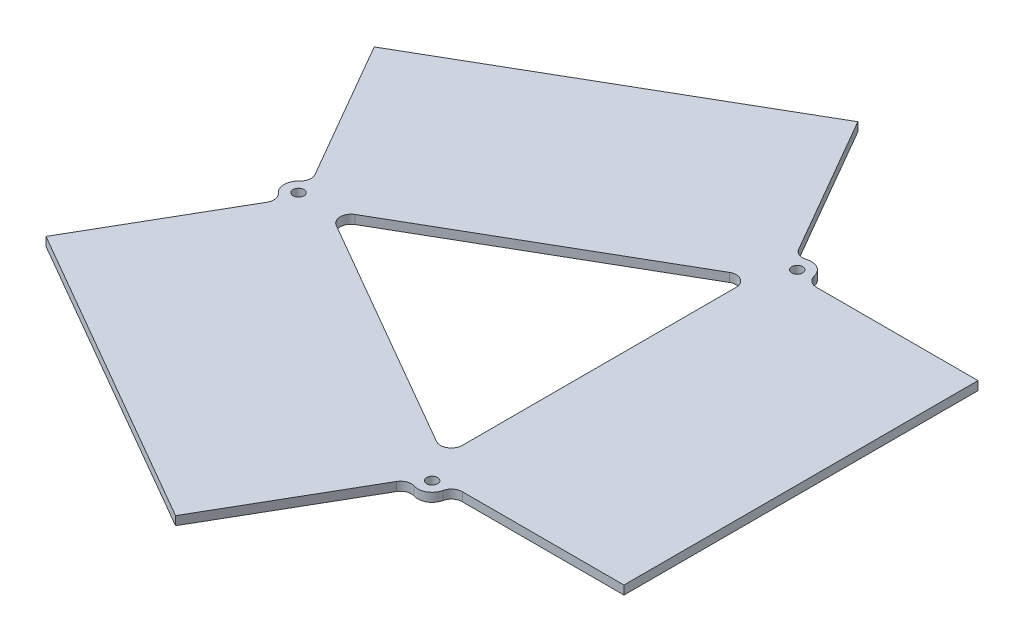
ISO-10303-21;
HEADER;
FILE_DESCRIPTION(('STEP AP214'),'2;1');
FILE_NAME('part.step','',(''),(''),'','','');
FILE_SCHEMA(('AUTOMOTIVE_DESIGN { 1 0 10303 214 1 1 1 1 }'));
ENDSEC;
DATA;
#1=APPLICATION_CONTEXT('core data for automotive mechanical design processes');
#2=APPLICATION_PROTOCOL_DEFINITION('international standard','automotive_design',2000,#1);
#3=PRODUCT_CONTEXT('',#1,'mechanical');
#4=PRODUCT('Part','Part','',(#3));
#5=PRODUCT_RELATED_PRODUCT_CATEGORY('part','',(#4));
#6=PRODUCT_DEFINITION_FORMATION('','',#4);
#7=PRODUCT_DEFINITION_CONTEXT('part definition',#1,'design');
#8=PRODUCT_DEFINITION('design','',#6,#7);
#9=PRODUCT_DEFINITION_SHAPE('','',#8);
#10=(LENGTH_UNIT() NAMED_UNIT(*) SI_UNIT(.MILLI.,.METRE.));
#11=(NAMED_UNIT(*) PLANE_ANGLE_UNIT() SI_UNIT($,.RADIAN.));
#12=(NAMED_UNIT(*) SI_UNIT($,.STERADIAN.) SOLID_ANGLE_UNIT());
#13=UNCERTAINTY_MEASURE_WITH_UNIT(LENGTH_MEASURE(1.E-05),#10,'distance_accuracy_value','');
#14=(GEOMETRIC_REPRESENTATION_CONTEXT(3) GLOBAL_UNCERTAINTY_ASSIGNED_CONTEXT((#13)) GLOBAL_UNIT_ASSIGNED_CONTEXT((#10,
#11,#12)) REPRESENTATION_CONTEXT('',''));
#15=CARTESIAN_POINT('',(0.,0.,0.));
#16=DIRECTION('',(0.,0.,1.));
#17=DIRECTION('',(1.,0.,0.));
#18=AXIS2_PLACEMENT_3D('',#15,#16,#17);
#19=CARTESIAN_POINT('',(-48.8921352138346,2.,28.227887426963));
#20=DIRECTION('',(-0.866025403784438,0.,0.500000000000001));
#21=DIRECTION('',(0.500000000000001,0.,0.866025403784438));
#22=AXIS2_PLACEMENT_3D('',#19,#20,#21);
#23=PLANE('',#22);
#24=DIRECTION('',(-0.500000000000001,0.,-0.866025403784438));
#25=VECTOR('',#24,1.);
#26=CARTESIAN_POINT('',(-48.8921352138346,0.,28.227887426963));
#27=LINE('',#26,#25);
#28=CARTESIAN_POINT('',(-85.4700101744345,0.,-35.1268504376975));
#29=VERTEX_POINT('',#28);
#30=CARTESIAN_POINT('',(-103.965757812806,0.,-67.1624250713291));
#31=VERTEX_POINT('',#30);
#32=EDGE_CURVE('E297',#29,#31,#27,.T.);
#33=ORIENTED_EDGE('',*,*,#32,.F.);
#34=DIRECTION('',(0.,-1.,0.));
#35=VECTOR('',#34,1.);
#36=CARTESIAN_POINT('',(-85.4700101744345,2.,-35.1268504376974));
#37=LINE('',#36,#35);
#38=CARTESIAN_POINT('',(-85.4700101744345,2.,-35.1268504376975));
#39=VERTEX_POINT('',#38);
#40=EDGE_CURVE('E63',#29,#39,#37,.F.);
#41=ORIENTED_EDGE('',*,*,#40,.T.);
#42=DIRECTION('',(-0.500000000000001,0.,-0.866025403784438));
#43=VECTOR('',#42,1.);
#44=CARTESIAN_POINT('',(-48.8921352138346,2.,28.227887426963));
#45=LINE('',#44,#43);
#46=CARTESIAN_POINT('',(-103.965757812806,2.,-67.1624250713291));
#47=VERTEX_POINT('',#46);
#48=EDGE_CURVE('E579',#39,#47,#45,.T.);
#49=ORIENTED_EDGE('',*,*,#48,.T.);
#50=DIRECTION('',(0.,-1.,0.));
#51=VECTOR('',#50,1.);
#52=CARTESIAN_POINT('',(-103.965757812806,2.,-67.1624250713291));
#53=LINE('',#52,#51);
#54=EDGE_CURVE('E276',#47,#31,#53,.T.);
#55=ORIENTED_EDGE('',*,*,#54,.T.);
#56=EDGE_LOOP('',(#33,#41,#49,#55));
#57=FACE_BOUND('',#56,.T.);
#58=ADVANCED_FACE('F47',(#57),#23,.T.);
#59=CARTESIAN_POINT('',(-83.7503568198725,2.,-29.6150024593988));
#60=DIRECTION('',(0.,-1.,0.));
#61=DIRECTION('',(0.,0.,-1.));
#62=AXIS2_PLACEMENT_3D('',#59,#60,#61);
#63=CYLINDRICAL_SURFACE('',#62,3.26666049839541);
#64=CARTESIAN_POINT('',(-83.7503568198725,0.,-29.6150024593988));
#65=DIRECTION('',(0.,1.,0.));
#66=DIRECTION('',(0.,0.,1.));
#67=AXIS2_PLACEMENT_3D('',#64,#65,#66);
#68=CIRCLE('',#67,3.26666049839541);
#69=CARTESIAN_POINT('',(-85.9509460743788,0.,-32.0292265054907));
#70=VERTEX_POINT('',#69);
#71=CARTESIAN_POINT('',(-85.9509460743788,0.,-27.2007784133069));
#72=VERTEX_POINT('',#71);
#73=EDGE_CURVE('E300',#70,#72,#68,.T.);
#74=ORIENTED_EDGE('',*,*,#73,.T.);
#75=DIRECTION('',(0.,-1.,0.));
#76=VECTOR('',#75,1.);
#77=CARTESIAN_POINT('',(-85.9509460743788,2.,-27.2007784133069));
#78=LINE('',#77,#76);
#79=CARTESIAN_POINT('',(-85.9509460743788,2.,-27.2007784133069));
#80=VERTEX_POINT('',#79);
#81=EDGE_CURVE('E414',#72,#80,#78,.F.);
#82=ORIENTED_EDGE('',*,*,#81,.T.);
#83=CARTESIAN_POINT('',(-83.7503568198725,2.,-29.6150024593988));
#84=DIRECTION('',(0.,1.,0.));
#85=DIRECTION('',(0.,0.,1.));
#86=AXIS2_PLACEMENT_3D('',#83,#84,#85);
#87=CIRCLE('',#86,3.26666049839541);
#88=CARTESIAN_POINT('',(-85.9509460743788,2.,-32.0292265054907));
#89=VERTEX_POINT('',#88);
#90=EDGE_CURVE('E233',#89,#80,#87,.T.);
#91=ORIENTED_EDGE('',*,*,#90,.F.);
#92=DIRECTION('',(0.,-1.,0.));
#93=VECTOR('',#92,1.);
#94=CARTESIAN_POINT('',(-85.9509460743788,2.,-32.0292265054907));
#95=LINE('',#94,#93);
#96=EDGE_CURVE('E410',#89,#70,#95,.T.);
#97=ORIENTED_EDGE('',*,*,#96,.T.);
#98=EDGE_LOOP('',(#74,#82,#91,#97));
#99=FACE_BOUND('',#98,.T.);
#100=ADVANCED_FACE('F471',(#99),#63,.T.);
#101=CARTESIAN_POINT('',(-74.5394796768128,2.,-43.0353886566623));
#102=DIRECTION('',(-0.86602540378444,0.,-0.499999999999998));
#103=DIRECTION('',(-0.499999999999998,0.,0.86602540378444));
#104=AXIS2_PLACEMENT_3D('',#101,#102,#103);
#105=PLANE('',#104);
#106=DIRECTION('',(0.499999999999998,0.,-0.86602540378444));
#107=VECTOR('',#106,1.);
#108=CARTESIAN_POINT('',(-74.5394796768128,2.,-43.0353886566623));
#109=LINE('',#108,#107);
#110=CARTESIAN_POINT('',(-103.965757812805,2.,7.9324201525299));
#111=VERTEX_POINT('',#110);
#112=CARTESIAN_POINT('',(-85.4700101744346,2.,-24.1031544811002));
#113=VERTEX_POINT('',#112);
#114=EDGE_CURVE('E211',#111,#113,#109,.T.);
#115=ORIENTED_EDGE('',*,*,#114,.T.);
#116=DIRECTION('',(0.,-1.,0.));
#117=VECTOR('',#116,1.);
#118=CARTESIAN_POINT('',(-85.4700101744346,2.,-24.1031544811002));
#119=LINE('',#118,#117);
#120=CARTESIAN_POINT('',(-85.4700101744346,0.,-24.1031544811002));
#121=VERTEX_POINT('',#120);
#122=EDGE_CURVE('E407',#113,#121,#119,.T.);
#123=ORIENTED_EDGE('',*,*,#122,.T.);
#124=DIRECTION('',(0.499999999999998,0.,-0.86602540378444));
#125=VECTOR('',#124,1.);
#126=CARTESIAN_POINT('',(-74.5394796768128,0.,-43.0353886566623));
#127=LINE('',#126,#125);
#128=CARTESIAN_POINT('',(-103.965757812805,0.,7.9324201525299));
#129=VERTEX_POINT('',#128);
#130=EDGE_CURVE('E214',#129,#121,#127,.T.);
#131=ORIENTED_EDGE('',*,*,#130,.F.);
#132=DIRECTION('',(0.,-1.,0.));
#133=VECTOR('',#132,1.);
#134=CARTESIAN_POINT('',(-103.965757812805,2.,7.9324201525299));
#135=LINE('',#134,#133);
#136=EDGE_CURVE('E207',#111,#129,#135,.T.);
#137=ORIENTED_EDGE('',*,*,#136,.F.);
#138=EDGE_LOOP('',(#115,#123,#131,#137));
#139=FACE_BOUND('',#138,.T.);
#140=ADVANCED_FACE('F209',(#139),#105,.T.);
#141=CARTESIAN_POINT('',(-29.4262781359925,2.,50.9678088091923));
#142=DIRECTION('',(-0.5,0.,0.866025403784439));
#143=DIRECTION('',(0.866025403784439,0.,0.5));
#144=AXIS2_PLACEMENT_3D('',#141,#142,#143);
#145=PLANE('',#144);
#146=DIRECTION('',(-0.866025403784439,0.,-0.5));
#147=VECTOR('',#146,1.);
#148=CARTESIAN_POINT('',(-29.4262781359925,0.,50.9678088091923));
#149=LINE('',#148,#147);
#150=CARTESIAN_POINT('',(-33.8177001062481,0.,48.43242015254));
#151=VERTEX_POINT('',#150);
#152=EDGE_CURVE('E306',#151,#129,#149,.T.);
#153=ORIENTED_EDGE('',*,*,#152,.F.);
#154=DIRECTION('',(0.,-1.,0.));
#155=VECTOR('',#154,1.);
#156=CARTESIAN_POINT('',(-33.8177001062481,2.,48.43242015254));
#157=LINE('',#156,#155);
#158=CARTESIAN_POINT('',(-33.8177001062481,2.,48.43242015254));
#159=VERTEX_POINT('',#158);
#160=EDGE_CURVE('E221',#159,#151,#157,.T.);
#161=ORIENTED_EDGE('',*,*,#160,.F.);
#162=DIRECTION('',(-0.866025403784439,0.,-0.5));
#163=VECTOR('',#162,1.);
#164=CARTESIAN_POINT('',(-29.4262781359925,2.,50.9678088091923));
#165=LINE('',#164,#163);
#166=EDGE_CURVE('E228',#159,#111,#165,.T.);
#167=ORIENTED_EDGE('',*,*,#166,.T.);
#168=ORIENTED_EDGE('',*,*,#136,.T.);
#169=EDGE_LOOP('',(#153,#161,#167,#168));
#170=FACE_BOUND('',#169,.T.);
#171=ADVANCED_FACE('F236',(#170),#145,.T.);
#172=CARTESIAN_POINT('',(-4.39142197025554,2.,-2.53538865665227));
#173=DIRECTION('',(0.866025403784439,0.,0.5));
#174=DIRECTION('',(0.5,0.,-0.866025403784439));
#175=AXIS2_PLACEMENT_3D('',#172,#173,#174);
#176=PLANE('',#175);
#177=DIRECTION('',(-0.5,0.,0.866025403784439));
#178=VECTOR('',#177,1.);
#179=CARTESIAN_POINT('',(-4.39142197025554,0.,-2.53538865665227));
#180=LINE('',#179,#178);
#181=CARTESIAN_POINT('',(-15.3219524678768,0.,16.3968455189089));
#182=VERTEX_POINT('',#181);
#183=EDGE_CURVE('E309',#182,#151,#180,.T.);
#184=ORIENTED_EDGE('',*,*,#183,.F.);
#185=DIRECTION('',(0.,-1.,0.));
#186=VECTOR('',#185,1.);
#187=CARTESIAN_POINT('',(-15.3219524678768,2.,16.3968455189089));
#188=LINE('',#187,#186);
#189=CARTESIAN_POINT('',(-15.3219524678768,2.,16.3968455189089));
#190=VERTEX_POINT('',#189);
#191=EDGE_CURVE('E400',#182,#190,#188,.F.);
#192=ORIENTED_EDGE('',*,*,#191,.T.);
#193=DIRECTION('',(-0.5,0.,0.866025403784439));
#194=VECTOR('',#193,1.);
#195=CARTESIAN_POINT('',(-4.39142197025554,2.,-2.53538865665227));
#196=LINE('',#195,#194);
#197=EDGE_CURVE('E239',#190,#159,#196,.T.);
#198=ORIENTED_EDGE('',*,*,#197,.T.);
#199=ORIENTED_EDGE('',*,*,#160,.T.);
#200=EDGE_LOOP('',(#184,#192,#198,#199));
#201=FACE_BOUND('',#200,.T.);
#202=ADVANCED_FACE('F653',(#201),#176,.T.);
#203=CARTESIAN_POINT('',(-11.4083787741549,2.,12.1516580390063));
#204=DIRECTION('',(0.,-1.,0.));
#205=DIRECTION('',(0.,0.,-1.));
#206=AXIS2_PLACEMENT_3D('',#203,#204,#205);
#207=CYLINDRICAL_SURFACE('',#206,3.26666049839439);
#208=CARTESIAN_POINT('',(-11.4083787741549,2.,12.1516580390063));
#209=DIRECTION('',(0.,1.,0.));
#210=DIRECTION('',(0.,0.,1.));
#211=AXIS2_PLACEMENT_3D('',#208,#209,#210);
#212=CIRCLE('',#211,3.26666049839439);
#213=CARTESIAN_POINT('',(-12.3988635012435,2.,15.264536259749));
#214=VERTEX_POINT('',#213);
#215=CARTESIAN_POINT('',(-8.21730479256005,2.,12.8503122136584));
#216=VERTEX_POINT('',#215);
#217=EDGE_CURVE('E242',#214,#216,#212,.T.);
#218=ORIENTED_EDGE('',*,*,#217,.F.);
#219=DIRECTION('',(0.,-1.,0.));
#220=VECTOR('',#219,1.);
#221=CARTESIAN_POINT('',(-12.3988635012435,2.,15.264536259749));
#222=LINE('',#221,#220);
#223=CARTESIAN_POINT('',(-12.3988635012435,0.,15.264536259749));
#224=VERTEX_POINT('',#223);
#225=EDGE_CURVE('E396',#214,#224,#222,.T.);
#226=ORIENTED_EDGE('',*,*,#225,.T.);
#227=CARTESIAN_POINT('',(-11.4083787741549,0.,12.1516580390063));
#228=DIRECTION('',(0.,1.,0.));
#229=DIRECTION('',(0.,0.,1.));
#230=AXIS2_PLACEMENT_3D('',#227,#228,#229);
#231=CIRCLE('',#230,3.26666049839439);
#232=CARTESIAN_POINT('',(-8.21730479256005,0.,12.8503122136584));
#233=VERTEX_POINT('',#232);
#234=EDGE_CURVE('E312',#224,#233,#231,.T.);
#235=ORIENTED_EDGE('',*,*,#234,.T.);
#236=DIRECTION('',(0.,-1.,0.));
#237=VECTOR('',#236,1.);
#238=CARTESIAN_POINT('',(-8.21730479256005,2.,12.8503122136584));
#239=LINE('',#238,#237);
#240=EDGE_CURVE('E393',#233,#216,#239,.F.);
#241=ORIENTED_EDGE('',*,*,#240,.T.);
#242=EDGE_LOOP('',(#218,#226,#235,#241));
#243=FACE_BOUND('',#242,.T.);
#244=ADVANCED_FACE('F546',(#243),#207,.T.);
#245=CARTESIAN_POINT('',(0.,2.,10.8849975406119));
#246=DIRECTION('',(0.,0.,1.));
#247=DIRECTION('',(1.,0.,0.));
#248=AXIS2_PLACEMENT_3D('',#245,#246,#247);
#249=PLANE('',#248);
#250=DIRECTION('',(-1.,0.,0.));
#251=VECTOR('',#250,1.);
#252=CARTESIAN_POINT('',(0.,2.,10.8849975406119));
#253=LINE('',#252,#251);
#254=CARTESIAN_POINT('',(31.2163435508749,2.,10.8849975406119));
#255=VERTEX_POINT('',#254);
#256=CARTESIAN_POINT('',(-5.77515172587062,2.,10.8849975406119));
#257=VERTEX_POINT('',#256);
#258=EDGE_CURVE('E249',#255,#257,#253,.T.);
#259=ORIENTED_EDGE('',*,*,#258,.T.);
#260=DIRECTION('',(0.,-1.,0.));
#261=VECTOR('',#260,1.);
#262=CARTESIAN_POINT('',(-5.77515172587062,2.,10.8849975406119));
#263=LINE('',#262,#261);
#264=CARTESIAN_POINT('',(-5.77515172587062,0.,10.8849975406119));
#265=VERTEX_POINT('',#264);
#266=EDGE_CURVE('E403',#257,#265,#263,.T.);
#267=ORIENTED_EDGE('',*,*,#266,.T.);
#268=DIRECTION('',(-1.,0.,0.));
#269=VECTOR('',#268,1.);
#270=CARTESIAN_POINT('',(0.,0.,10.8849975406119));
#271=LINE('',#270,#269);
#272=CARTESIAN_POINT('',(31.2163435508749,0.,10.8849975406119));
#273=VERTEX_POINT('',#272);
#274=EDGE_CURVE('E316',#273,#265,#271,.T.);
#275=ORIENTED_EDGE('',*,*,#274,.F.);
#276=DIRECTION('',(0.,-1.,0.));
#277=VECTOR('',#276,1.);
#278=CARTESIAN_POINT('',(31.2163435508749,2.,10.8849975406119));
#279=LINE('',#278,#277);
#280=EDGE_CURVE('E354',#255,#273,#279,.T.);
#281=ORIENTED_EDGE('',*,*,#280,.F.);
#282=EDGE_LOOP('',(#259,#267,#275,#281));
#283=FACE_BOUND('',#282,.T.);
#284=ADVANCED_FACE('F553',(#283),#249,.T.);
#285=CARTESIAN_POINT('',(31.2163435508749,2.,0.));
#286=DIRECTION('',(1.,0.,0.));
#287=DIRECTION('',(0.,0.,-1.));
#288=AXIS2_PLACEMENT_3D('',#285,#286,#287);
#289=PLANE('',#288);
#290=DIRECTION('',(0.,0.,1.));
#291=VECTOR('',#290,1.);
#292=CARTESIAN_POINT('',(31.2163435508749,0.,0.));
#293=LINE('',#292,#291);
#294=CARTESIAN_POINT('',(31.2163435508749,0.,-70.115002459401));
#295=VERTEX_POINT('',#294);
#296=EDGE_CURVE('E320',#295,#273,#293,.T.);
#297=ORIENTED_EDGE('',*,*,#296,.F.);
#298=DIRECTION('',(0.,-1.,0.));
#299=VECTOR('',#298,1.);
#300=CARTESIAN_POINT('',(31.2163435508749,2.,-70.115002459401));
#301=LINE('',#300,#299);
#302=CARTESIAN_POINT('',(31.2163435508749,2.,-70.115002459401));
#303=VERTEX_POINT('',#302);
#304=EDGE_CURVE('E350',#303,#295,#301,.T.);
#305=ORIENTED_EDGE('',*,*,#304,.F.);
#306=DIRECTION('',(0.,0.,1.));
#307=VECTOR('',#306,1.);
#308=CARTESIAN_POINT('',(31.2163435508749,2.,0.));
#309=LINE('',#308,#307);
#310=EDGE_CURVE('E253',#303,#255,#309,.T.);
#311=ORIENTED_EDGE('',*,*,#310,.T.);
#312=ORIENTED_EDGE('',*,*,#280,.T.);
#313=EDGE_LOOP('',(#297,#305,#311,#312));
#314=FACE_BOUND('',#313,.T.);
#315=ADVANCED_FACE('F557',(#314),#289,.T.);
#316=CARTESIAN_POINT('',(0.,2.,-70.115002459401));
#317=DIRECTION('',(0.,0.,-1.));
#318=DIRECTION('',(-1.,0.,0.));
#319=AXIS2_PLACEMENT_3D('',#316,#317,#318);
#320=PLANE('',#319);
#321=DIRECTION('',(1.,0.,0.));
#322=VECTOR('',#321,1.);
#323=CARTESIAN_POINT('',(0.,0.,-70.115002459401));
#324=LINE('',#323,#322);
#325=CARTESIAN_POINT('',(-5.77515172586967,0.,-70.115002459401));
#326=VERTEX_POINT('',#325);
#327=EDGE_CURVE('E324',#326,#295,#324,.T.);
#328=ORIENTED_EDGE('',*,*,#327,.F.);
#329=DIRECTION('',(0.,-1.,0.));
#330=VECTOR('',#329,1.);
#331=CARTESIAN_POINT('',(-5.77515172586967,2.,-70.115002459401));
#332=LINE('',#331,#330);
#333=CARTESIAN_POINT('',(-5.77515172586967,2.,-70.115002459401));
#334=VERTEX_POINT('',#333);
#335=EDGE_CURVE('E390',#326,#334,#332,.F.);
#336=ORIENTED_EDGE('',*,*,#335,.T.);
#337=DIRECTION('',(1.,0.,0.));
#338=VECTOR('',#337,1.);
#339=CARTESIAN_POINT('',(0.,2.,-70.115002459401));
#340=LINE('',#339,#338);
#341=EDGE_CURVE('E257',#334,#303,#340,.T.);
#342=ORIENTED_EDGE('',*,*,#341,.T.);
#343=ORIENTED_EDGE('',*,*,#304,.T.);
#344=EDGE_LOOP('',(#328,#336,#342,#343));
#345=FACE_BOUND('',#344,.T.);
#346=ADVANCED_FACE('F644',(#345),#320,.T.);
#347=CARTESIAN_POINT('',(-11.4083787741549,2.,-71.3816629577962));
#348=DIRECTION('',(0.,-1.,0.));
#349=DIRECTION('',(0.,0.,-1.));
#350=AXIS2_PLACEMENT_3D('',#347,#348,#349);
#351=CYLINDRICAL_SURFACE('',#350,3.26666049839515);
#352=CARTESIAN_POINT('',(-11.4083787741549,0.,-71.3816629577962));
#353=DIRECTION('',(0.,1.,0.));
#354=DIRECTION('',(0.,0.,1.));
#355=AXIS2_PLACEMENT_3D('',#352,#353,#354);
#356=CIRCLE('',#355,3.26666049839515);
#357=CARTESIAN_POINT('',(-8.21730479255918,0.,-72.0803171324479));
#358=VERTEX_POINT('',#357);
#359=CARTESIAN_POINT('',(-12.3988635012443,0.,-74.4945411785394));
#360=VERTEX_POINT('',#359);
#361=EDGE_CURVE('E327',#358,#360,#356,.T.);
#362=ORIENTED_EDGE('',*,*,#361,.T.);
#363=DIRECTION('',(0.,-1.,0.));
#364=VECTOR('',#363,1.);
#365=CARTESIAN_POINT('',(-12.3988635012443,2.,-74.4945411785394));
#366=LINE('',#365,#364);
#367=CARTESIAN_POINT('',(-12.3988635012443,2.,-74.4945411785394));
#368=VERTEX_POINT('',#367);
#369=EDGE_CURVE('E387',#360,#368,#366,.F.);
#370=ORIENTED_EDGE('',*,*,#369,.T.);
#371=CARTESIAN_POINT('',(-11.4083787741549,2.,-71.3816629577962));
#372=DIRECTION('',(0.,1.,0.));
#373=DIRECTION('',(0.,0.,1.));
#374=AXIS2_PLACEMENT_3D('',#371,#372,#373);
#375=CIRCLE('',#374,3.26666049839515);
#376=CARTESIAN_POINT('',(-8.21730479255918,2.,-72.0803171324479));
#377=VERTEX_POINT('',#376);
#378=EDGE_CURVE('E260',#377,#368,#375,.T.);
#379=ORIENTED_EDGE('',*,*,#378,.F.);
#380=DIRECTION('',(0.,-1.,0.));
#381=VECTOR('',#380,1.);
#382=CARTESIAN_POINT('',(-8.21730479255918,2.,-72.0803171324479));
#383=LINE('',#382,#381);
#384=EDGE_CURVE('E383',#377,#358,#383,.T.);
#385=ORIENTED_EDGE('',*,*,#384,.T.);
#386=EDGE_LOOP('',(#362,#370,#379,#385));
#387=FACE_BOUND('',#386,.T.);
#388=ADVANCED_FACE('F567',(#387),#351,.T.);
#389=CARTESIAN_POINT('',(21.2559224927185,2.,-12.2721125730448));
#390=DIRECTION('',(0.866025403784439,0.,-0.5));
#391=DIRECTION('',(-0.5,0.,-0.866025403784439));
#392=AXIS2_PLACEMENT_3D('',#389,#390,#391);
#393=PLANE('',#392);
#394=DIRECTION('',(0.5,0.,0.866025403784439));
#395=VECTOR('',#394,1.);
#396=CARTESIAN_POINT('',(21.2559224927185,2.,-12.2721125730448));
#397=LINE('',#396,#395);
#398=CARTESIAN_POINT('',(-33.817700106253,2.,-107.662425071337));
#399=VERTEX_POINT('',#398);
#400=CARTESIAN_POINT('',(-15.3219524678779,2.,-75.6268504376992));
#401=VERTEX_POINT('',#400);
#402=EDGE_CURVE('E264',#399,#401,#397,.T.);
#403=ORIENTED_EDGE('',*,*,#402,.T.);
#404=DIRECTION('',(0.,-1.,0.));
#405=VECTOR('',#404,1.);
#406=CARTESIAN_POINT('',(-15.3219524678779,2.,-75.6268504376992));
#407=LINE('',#406,#405);
#408=CARTESIAN_POINT('',(-15.3219524678779,0.,-75.6268504376992));
#409=VERTEX_POINT('',#408);
#410=EDGE_CURVE('E379',#401,#409,#407,.T.);
#411=ORIENTED_EDGE('',*,*,#410,.T.);
#412=DIRECTION('',(0.5,0.,0.866025403784439));
#413=VECTOR('',#412,1.);
#414=CARTESIAN_POINT('',(21.2559224927185,0.,-12.2721125730448));
#415=LINE('',#414,#413);
#416=CARTESIAN_POINT('',(-33.817700106253,0.,-107.662425071337));
#417=VERTEX_POINT('',#416);
#418=EDGE_CURVE('E331',#417,#409,#415,.T.);
#419=ORIENTED_EDGE('',*,*,#418,.F.);
#420=DIRECTION('',(0.,-1.,0.));
#421=VECTOR('',#420,1.);
#422=CARTESIAN_POINT('',(-33.817700106253,2.,-107.662425071337));
#423=LINE('',#422,#421);
#424=EDGE_CURVE('E347',#399,#417,#423,.T.);
#425=ORIENTED_EDGE('',*,*,#424,.F.);
#426=EDGE_LOOP('',(#403,#411,#419,#425));
#427=FACE_BOUND('',#426,.T.);
#428=ADVANCED_FACE('F514',(#427),#393,.T.);
#429=CARTESIAN_POINT('',(-14.9339142191549,2.,0.));
#430=DIRECTION('',(-1.,0.,0.));
#431=DIRECTION('',(0.,0.,1.));
#432=AXIS2_PLACEMENT_3D('',#429,#430,#431);
#433=PLANE('',#432);
#434=DIRECTION('',(0.,0.,-1.));
#435=VECTOR('',#434,1.);
#436=CARTESIAN_POINT('',(-14.9339142191549,0.,0.));
#437=LINE('',#436,#435);
#438=CARTESIAN_POINT('',(-14.9339142191549,0.,1.71512450545913));
#439=VERTEX_POINT('',#438);
#440=CARTESIAN_POINT('',(-14.9339142191549,0.,-60.9451294242495));
#441=VERTEX_POINT('',#440);
#442=EDGE_CURVE('E277',#439,#441,#437,.T.);
#443=ORIENTED_EDGE('',*,*,#442,.F.);
#444=DIRECTION('',(0.,-1.,0.));
#445=VECTOR('',#444,1.);
#446=CARTESIAN_POINT('',(-14.9339142191549,2.,1.71512450545913));
#447=LINE('',#446,#445);
#448=CARTESIAN_POINT('',(-14.9339142191549,2.,1.71512450545913));
#449=VERTEX_POINT('',#448);
#450=EDGE_CURVE('E369',#439,#449,#447,.F.);
#451=ORIENTED_EDGE('',*,*,#450,.T.);
#452=DIRECTION('',(0.,0.,-1.));
#453=VECTOR('',#452,1.);
#454=CARTESIAN_POINT('',(-14.9339142191549,2.,0.));
#455=LINE('',#454,#453);
#456=CARTESIAN_POINT('',(-14.9339142191549,2.,-60.9451294242495));
#457=VERTEX_POINT('',#456);
#458=EDGE_CURVE('E343',#449,#457,#455,.T.);
#459=ORIENTED_EDGE('',*,*,#458,.T.);
#460=DIRECTION('',(0.,-1.,0.));
#461=VECTOR('',#460,1.);
#462=CARTESIAN_POINT('',(-14.9339142191549,2.,-60.9451294242495));
#463=LINE('',#462,#461);
#464=EDGE_CURVE('E365',#457,#441,#463,.T.);
#465=ORIENTED_EDGE('',*,*,#464,.T.);
#466=EDGE_LOOP('',(#443,#451,#459,#465));
#467=FACE_BOUND('',#466,.T.);
#468=ADVANCED_FACE('F510',(#467),#433,.T.);
#469=CARTESIAN_POINT('',(-6.35114925097914,2.,11.0005131891489));
#470=DIRECTION('',(0.5,0.,-0.866025403784439));
#471=DIRECTION('',(-0.866025403784439,0.,-0.5));
#472=AXIS2_PLACEMENT_3D('',#469,#470,#471);
#473=PLANE('',#472);
#474=DIRECTION('',(0.866025403784439,0.,0.5));
#475=VECTOR('',#474,1.);
#476=CARTESIAN_POINT('',(-6.35114925097914,2.,11.0005131891489));
#477=LINE('',#476,#475);
#478=CARTESIAN_POINT('',(-72.9492859298721,2.,-27.4499389499374));
#479=VERTEX_POINT('',#478);
#480=CARTESIAN_POINT('',(-18.6839142191549,2.,3.88018801492023));
#481=VERTEX_POINT('',#480);
#482=EDGE_CURVE('E597',#479,#481,#477,.T.);
#483=ORIENTED_EDGE('',*,*,#482,.T.);
#484=DIRECTION('',(0.,-1.,0.));
#485=VECTOR('',#484,1.);
#486=CARTESIAN_POINT('',(-18.6839142191549,0.,3.88018801492023));
#487=LINE('',#486,#485);
#488=CARTESIAN_POINT('',(-18.6839142191549,0.,3.88018801492023));
#489=VERTEX_POINT('',#488);
#490=EDGE_CURVE('E361',#481,#489,#487,.T.);
#491=ORIENTED_EDGE('',*,*,#490,.T.);
#492=DIRECTION('',(0.866025403784439,0.,0.5));
#493=VECTOR('',#492,1.);
#494=CARTESIAN_POINT('',(-6.35114925097914,0.,11.0005131891489));
#495=LINE('',#494,#493);
#496=CARTESIAN_POINT('',(-72.9492859298721,0.,-27.4499389499374));
#497=VERTEX_POINT('',#496);
#498=EDGE_CURVE('E281',#497,#489,#495,.T.);
#499=ORIENTED_EDGE('',*,*,#498,.F.);
#500=DIRECTION('',(0.,-1.,0.));
#501=VECTOR('',#500,1.);
#502=CARTESIAN_POINT('',(-72.9492859298721,2.,-27.4499389499374));
#503=LINE('',#502,#501);
#504=EDGE_CURVE('E220',#497,#479,#503,.F.);
#505=ORIENTED_EDGE('',*,*,#504,.T.);
#506=EDGE_LOOP('',(#483,#491,#499,#505));
#507=FACE_BOUND('',#506,.T.);
#508=ADVANCED_FACE('F507',(#507),#473,.T.);
#509=CARTESIAN_POINT('',(-55.0736225989715,2.,-95.3903124982921));
#510=DIRECTION('',(-0.5,0.,-0.866025403784439));
#511=DIRECTION('',(-0.866025403784439,0.,0.5));
#512=AXIS2_PLACEMENT_3D('',#509,#510,#511);
#513=PLANE('',#512);
#514=DIRECTION('',(0.866025403784439,0.,-0.5));
#515=VECTOR('',#514,1.);
#516=CARTESIAN_POINT('',(-55.0736225989715,0.,-95.3903124982921));
#517=LINE('',#516,#515);
#518=EDGE_CURVE('E335',#31,#417,#517,.T.);
#519=ORIENTED_EDGE('',*,*,#518,.F.);
#520=ORIENTED_EDGE('',*,*,#54,.F.);
#521=DIRECTION('',(0.866025403784439,0.,-0.5));
#522=VECTOR('',#521,1.);
#523=CARTESIAN_POINT('',(-55.0736225989715,2.,-95.3903124982921));
#524=LINE('',#523,#522);
#525=EDGE_CURVE('E268',#47,#399,#524,.T.);
#526=ORIENTED_EDGE('',*,*,#525,.T.);
#527=ORIENTED_EDGE('',*,*,#424,.T.);
#528=EDGE_LOOP('',(#519,#520,#526,#527));
#529=FACE_BOUND('',#528,.T.);
#530=ADVANCED_FACE('F497',(#529),#513,.T.);
#531=CARTESIAN_POINT('',(-11.4083787741549,2.,12.1516580390063));
#532=DIRECTION('',(0.,-1.,0.));
#533=DIRECTION('',(0.,0.,-1.));
#534=AXIS2_PLACEMENT_3D('',#531,#532,#533);
#535=CYLINDRICAL_SURFACE('',#534,1.24999999998665);
#536=CARTESIAN_POINT('',(-11.4083787741549,2.,12.1516580390063));
#537=DIRECTION('',(0.,1.,0.));
#538=DIRECTION('',(0.,0.,1.));
#539=AXIS2_PLACEMENT_3D('',#536,#537,#538);
#540=CIRCLE('',#539,1.24999999998665);
#541=CARTESIAN_POINT('',(-11.4083787741549,2.,13.4016580389929));
#542=VERTEX_POINT('',#541);
#543=EDGE_CURVE('E582',#542,#542,#540,.T.);
#544=ORIENTED_EDGE('',*,*,#543,.T.);
#545=EDGE_LOOP('',(#544));
#546=FACE_BOUND('',#545,.T.);
#547=CARTESIAN_POINT('',(-11.4083787741549,0.,12.1516580390063));
#548=DIRECTION('',(0.,1.,0.));
#549=DIRECTION('',(0.,0.,1.));
#550=AXIS2_PLACEMENT_3D('',#547,#548,#549);
#551=CIRCLE('',#550,1.24999999998665);
#552=CARTESIAN_POINT('',(-11.4083787741549,0.,13.4016580389929));
#553=VERTEX_POINT('',#552);
#554=EDGE_CURVE('E293',#553,#553,#551,.T.);
#555=ORIENTED_EDGE('',*,*,#554,.F.);
#556=EDGE_LOOP('',(#555));
#557=FACE_BOUND('',#556,.T.);
#558=ADVANCED_FACE('F493',(#546,#557),#535,.F.);
#559=CARTESIAN_POINT('',(-11.4083787741549,2.,-71.3816629577962));
#560=DIRECTION('',(0.,-1.,0.));
#561=DIRECTION('',(0.,0.,-1.));
#562=AXIS2_PLACEMENT_3D('',#559,#560,#561);
#563=CYLINDRICAL_SURFACE('',#562,1.25000000000938);
#564=CARTESIAN_POINT('',(-11.4083787741549,2.,-71.3816629577962));
#565=DIRECTION('',(0.,1.,0.));
#566=DIRECTION('',(0.,0.,1.));
#567=AXIS2_PLACEMENT_3D('',#564,#565,#566);
#568=CIRCLE('',#567,1.25000000000938);
#569=CARTESIAN_POINT('',(-11.4083787741549,2.,-70.1316629577868));
#570=VERTEX_POINT('',#569);
#571=EDGE_CURVE('E587',#570,#570,#568,.T.);
#572=ORIENTED_EDGE('',*,*,#571,.T.);
#573=EDGE_LOOP('',(#572));
#574=FACE_BOUND('',#573,.T.);
#575=CARTESIAN_POINT('',(-11.4083787741549,0.,-71.3816629577962));
#576=DIRECTION('',(0.,1.,0.));
#577=DIRECTION('',(0.,0.,1.));
#578=AXIS2_PLACEMENT_3D('',#575,#576,#577);
#579=CIRCLE('',#578,1.25000000000938);
#580=CARTESIAN_POINT('',(-11.4083787741549,0.,-70.1316629577868));
#581=VERTEX_POINT('',#580);
#582=EDGE_CURVE('E289',#581,#581,#579,.T.);
#583=ORIENTED_EDGE('',*,*,#582,.F.);
#584=EDGE_LOOP('',(#583));
#585=FACE_BOUND('',#584,.T.);
#586=ADVANCED_FACE('F496',(#574,#585),#563,.F.);
#587=CARTESIAN_POINT('',(-31.9984937139495,2.,-55.4230168782458));
#588=DIRECTION('',(-0.499999999999919,0.,-0.866025403784485));
#589=DIRECTION('',(-0.866025403784485,0.,0.499999999999919));
#590=AXIS2_PLACEMENT_3D('',#587,#588,#589);
#591=PLANE('',#590);
#592=DIRECTION('',(0.866025403784485,0.,-0.499999999999919));
#593=VECTOR('',#592,1.);
#594=CARTESIAN_POINT('',(-31.9984937139495,0.,-55.4230168782458));
#595=LINE('',#594,#593);
#596=CARTESIAN_POINT('',(-72.9492859298718,0.,-31.7800659688598));
#597=VERTEX_POINT('',#596);
#598=CARTESIAN_POINT('',(-18.6839142191547,0.,-63.1101929337107));
#599=VERTEX_POINT('',#598);
#600=EDGE_CURVE('E285',#597,#599,#595,.T.);
#601=ORIENTED_EDGE('',*,*,#600,.T.);
#602=DIRECTION('',(0.,-1.,0.));
#603=VECTOR('',#602,1.);
#604=CARTESIAN_POINT('',(-18.6839142191547,2.,-63.1101929337107));
#605=LINE('',#604,#603);
#606=CARTESIAN_POINT('',(-18.6839142191547,2.,-63.1101929337107));
#607=VERTEX_POINT('',#606);
#608=EDGE_CURVE('E376',#599,#607,#605,.F.);
#609=ORIENTED_EDGE('',*,*,#608,.T.);
#610=DIRECTION('',(0.866025403784485,0.,-0.499999999999919));
#611=VECTOR('',#610,1.);
#612=CARTESIAN_POINT('',(-31.9984937139495,2.,-55.4230168782458));
#613=LINE('',#612,#611);
#614=CARTESIAN_POINT('',(-72.9492859298718,2.,-31.7800659688598));
#615=VERTEX_POINT('',#614);
#616=EDGE_CURVE('E593',#615,#607,#613,.T.);
#617=ORIENTED_EDGE('',*,*,#616,.F.);
#618=DIRECTION('',(0.,-1.,0.));
#619=VECTOR('',#618,1.);
#620=CARTESIAN_POINT('',(-72.9492859298718,2.,-31.7800659688598));
#621=LINE('',#620,#619);
#622=EDGE_CURVE('E372',#615,#597,#621,.T.);
#623=ORIENTED_EDGE('',*,*,#622,.T.);
#624=EDGE_LOOP('',(#601,#609,#617,#623));
#625=FACE_BOUND('',#624,.T.);
#626=ADVANCED_FACE('F501',(#625),#591,.F.);
#627=CARTESIAN_POINT('',(-83.7503568198725,2.,-29.6150024593988));
#628=DIRECTION('',(0.,-1.,0.));
#629=DIRECTION('',(0.,0.,-1.));
#630=AXIS2_PLACEMENT_3D('',#627,#628,#629);
#631=CYLINDRICAL_SURFACE('',#630,1.25);
#632=CARTESIAN_POINT('',(-83.7503568198725,2.,-29.6150024593988));
#633=DIRECTION('',(0.,1.,0.));
#634=DIRECTION('',(0.,0.,1.));
#635=AXIS2_PLACEMENT_3D('',#632,#633,#634);
#636=CIRCLE('',#635,1.25);
#637=CARTESIAN_POINT('',(-83.7503568198725,2.,-28.3650024593988));
#638=VERTEX_POINT('',#637);
#639=EDGE_CURVE('E272',#638,#638,#636,.T.);
#640=ORIENTED_EDGE('',*,*,#639,.T.);
#641=EDGE_LOOP('',(#640));
#642=FACE_BOUND('',#641,.T.);
#643=CARTESIAN_POINT('',(-83.7503568198725,0.,-29.6150024593988));
#644=DIRECTION('',(0.,1.,0.));
#645=DIRECTION('',(0.,0.,1.));
#646=AXIS2_PLACEMENT_3D('',#643,#644,#645);
#647=CIRCLE('',#646,1.25);
#648=CARTESIAN_POINT('',(-83.7503568198725,0.,-28.3650024593988));
#649=VERTEX_POINT('',#648);
#650=EDGE_CURVE('E339',#649,#649,#647,.T.);
#651=ORIENTED_EDGE('',*,*,#650,.F.);
#652=EDGE_LOOP('',(#651));
#653=FACE_BOUND('',#652,.T.);
#654=ADVANCED_FACE('F505',(#642,#653),#631,.F.);
#655=CARTESIAN_POINT('',(0.,2.,0.));
#656=DIRECTION('',(0.,1.,0.));
#657=DIRECTION('',(0.,0.,1.));
#658=AXIS2_PLACEMENT_3D('',#655,#656,#657);
#659=PLANE('',#658);
#660=ORIENTED_EDGE('',*,*,#458,.F.);
#661=CARTESIAN_POINT('',(-17.4339142191549,2.,1.71512450545913));
#662=DIRECTION('',(0.,1.,0.));
#663=DIRECTION('',(0.,0.,1.));
#664=AXIS2_PLACEMENT_3D('',#661,#662,#663);
#665=CIRCLE('',#664,2.5);
#666=EDGE_CURVE('E422',#449,#481,#665,.F.);
#667=ORIENTED_EDGE('',*,*,#666,.T.);
#668=ORIENTED_EDGE('',*,*,#482,.F.);
#669=CARTESIAN_POINT('',(-71.6992859298721,2.,-29.6150024593985));
#670=DIRECTION('',(0.,1.,0.));
#671=DIRECTION('',(0.,0.,1.));
#672=AXIS2_PLACEMENT_3D('',#669,#670,#671);
#673=CIRCLE('',#672,2.5);
#674=EDGE_CURVE('E434',#479,#615,#673,.F.);
#675=ORIENTED_EDGE('',*,*,#674,.T.);
#676=ORIENTED_EDGE('',*,*,#616,.T.);
#677=CARTESIAN_POINT('',(-17.4339142191549,2.,-60.9451294242495));
#678=DIRECTION('',(0.,1.,0.));
#679=DIRECTION('',(0.,0.,1.));
#680=AXIS2_PLACEMENT_3D('',#677,#678,#679);
#681=CIRCLE('',#680,2.5);
#682=EDGE_CURVE('E428',#607,#457,#681,.F.);
#683=ORIENTED_EDGE('',*,*,#682,.T.);
#684=EDGE_LOOP('',(#660,#667,#668,#675,#676,#683));
#685=FACE_BOUND('',#684,.T.);
#686=ORIENTED_EDGE('',*,*,#571,.F.);
#687=EDGE_LOOP('',(#686));
#688=FACE_BOUND('',#687,.T.);
#689=ORIENTED_EDGE('',*,*,#543,.F.);
#690=EDGE_LOOP('',(#689));
#691=FACE_BOUND('',#690,.T.);
#692=ORIENTED_EDGE('',*,*,#48,.F.);
#693=CARTESIAN_POINT('',(-87.6350736838956,2.,-33.8768504376974));
#694=DIRECTION('',(0.,1.,0.));
#695=DIRECTION('',(0.,0.,1.));
#696=AXIS2_PLACEMENT_3D('',#693,#694,#695);
#697=CIRCLE('',#696,2.5);
#698=EDGE_CURVE('E11',#39,#89,#697,.F.);
#699=ORIENTED_EDGE('',*,*,#698,.T.);
#700=ORIENTED_EDGE('',*,*,#90,.T.);
#701=CARTESIAN_POINT('',(-87.6350736838957,2.,-25.3531544811002));
#702=DIRECTION('',(0.,1.,0.));
#703=DIRECTION('',(0.,0.,1.));
#704=AXIS2_PLACEMENT_3D('',#701,#702,#703);
#705=CIRCLE('',#704,2.5);
#706=EDGE_CURVE('E231',#80,#113,#705,.F.);
#707=ORIENTED_EDGE('',*,*,#706,.T.);
#708=ORIENTED_EDGE('',*,*,#114,.F.);
#709=ORIENTED_EDGE('',*,*,#166,.F.);
#710=ORIENTED_EDGE('',*,*,#197,.F.);
#711=CARTESIAN_POINT('',(-13.1568889584157,2.,17.6468455189089));
#712=DIRECTION('',(0.,1.,0.));
#713=DIRECTION('',(0.,0.,1.));
#714=AXIS2_PLACEMENT_3D('',#711,#712,#713);
#715=CIRCLE('',#714,2.5);
#716=EDGE_CURVE('E452',#190,#214,#715,.F.);
#717=ORIENTED_EDGE('',*,*,#716,.T.);
#718=ORIENTED_EDGE('',*,*,#217,.T.);
#719=CARTESIAN_POINT('',(-5.77515172587062,2.,13.3849975406119));
#720=DIRECTION('',(0.,1.,0.));
#721=DIRECTION('',(0.,0.,1.));
#722=AXIS2_PLACEMENT_3D('',#719,#720,#721);
#723=CIRCLE('',#722,2.5);
#724=EDGE_CURVE('E458',#216,#257,#723,.F.);
#725=ORIENTED_EDGE('',*,*,#724,.T.);
#726=ORIENTED_EDGE('',*,*,#258,.F.);
#727=ORIENTED_EDGE('',*,*,#310,.F.);
#728=ORIENTED_EDGE('',*,*,#341,.F.);
#729=CARTESIAN_POINT('',(-5.77515172586967,2.,-72.615002459401));
#730=DIRECTION('',(0.,1.,0.));
#731=DIRECTION('',(0.,0.,1.));
#732=AXIS2_PLACEMENT_3D('',#729,#730,#731);
#733=CIRCLE('',#732,2.5);
#734=EDGE_CURVE('E446',#334,#377,#733,.F.);
#735=ORIENTED_EDGE('',*,*,#734,.T.);
#736=ORIENTED_EDGE('',*,*,#378,.T.);
#737=CARTESIAN_POINT('',(-13.1568889584168,2.,-76.8768504376992));
#738=DIRECTION('',(0.,1.,0.));
#739=DIRECTION('',(0.,0.,1.));
#740=AXIS2_PLACEMENT_3D('',#737,#738,#739);
#741=CIRCLE('',#740,2.5);
#742=EDGE_CURVE('E440',#368,#401,#741,.F.);
#743=ORIENTED_EDGE('',*,*,#742,.T.);
#744=ORIENTED_EDGE('',*,*,#402,.F.);
#745=ORIENTED_EDGE('',*,*,#525,.F.);
#746=EDGE_LOOP('',(#692,#699,#700,#707,#708,#709,#710,#717,#718,#725,#726,#727,#728,#735,#736,
#743,#744,#745));
#747=FACE_BOUND('',#746,.T.);
#748=ORIENTED_EDGE('',*,*,#639,.F.);
#749=EDGE_LOOP('',(#748));
#750=FACE_BOUND('',#749,.T.);
#751=ADVANCED_FACE('F225',(#685,#688,#691,#747,#750),#659,.T.);
#752=CARTESIAN_POINT('',(0.,0.,0.));
#753=DIRECTION('',(0.,1.,0.));
#754=DIRECTION('',(0.,0.,1.));
#755=AXIS2_PLACEMENT_3D('',#752,#753,#754);
#756=PLANE('',#755);
#757=ORIENTED_EDGE('',*,*,#498,.T.);
#758=CARTESIAN_POINT('',(-17.4339142191549,0.,1.71512450545913));
#759=DIRECTION('',(0.,1.,0.));
#760=DIRECTION('',(0.,0.,1.));
#761=AXIS2_PLACEMENT_3D('',#758,#759,#760);
#762=CIRCLE('',#761,2.5);
#763=EDGE_CURVE('E419',#489,#439,#762,.T.);
#764=ORIENTED_EDGE('',*,*,#763,.T.);
#765=ORIENTED_EDGE('',*,*,#442,.T.);
#766=CARTESIAN_POINT('',(-17.4339142191549,0.,-60.9451294242495));
#767=DIRECTION('',(0.,1.,0.));
#768=DIRECTION('',(0.,0.,1.));
#769=AXIS2_PLACEMENT_3D('',#766,#767,#768);
#770=CIRCLE('',#769,2.5);
#771=EDGE_CURVE('E425',#441,#599,#770,.T.);
#772=ORIENTED_EDGE('',*,*,#771,.T.);
#773=ORIENTED_EDGE('',*,*,#600,.F.);
#774=CARTESIAN_POINT('',(-71.6992859298721,0.,-29.6150024593985));
#775=DIRECTION('',(0.,1.,0.));
#776=DIRECTION('',(0.,0.,1.));
#777=AXIS2_PLACEMENT_3D('',#774,#775,#776);
#778=CIRCLE('',#777,2.5);
#779=EDGE_CURVE('E431',#597,#497,#778,.T.);
#780=ORIENTED_EDGE('',*,*,#779,.T.);
#781=EDGE_LOOP('',(#757,#764,#765,#772,#773,#780));
#782=FACE_BOUND('',#781,.T.);
#783=ORIENTED_EDGE('',*,*,#582,.T.);
#784=EDGE_LOOP('',(#783));
#785=FACE_BOUND('',#784,.T.);
#786=ORIENTED_EDGE('',*,*,#554,.T.);
#787=EDGE_LOOP('',(#786));
#788=FACE_BOUND('',#787,.T.);
#789=ORIENTED_EDGE('',*,*,#73,.F.);
#790=CARTESIAN_POINT('',(-87.6350736838956,0.,-33.8768504376974));
#791=DIRECTION('',(0.,1.,0.));
#792=DIRECTION('',(0.,0.,1.));
#793=AXIS2_PLACEMENT_3D('',#790,#791,#792);
#794=CIRCLE('',#793,2.5);
#795=EDGE_CURVE('E56',#70,#29,#794,.T.);
#796=ORIENTED_EDGE('',*,*,#795,.T.);
#797=ORIENTED_EDGE('',*,*,#32,.T.);
#798=ORIENTED_EDGE('',*,*,#518,.T.);
#799=ORIENTED_EDGE('',*,*,#418,.T.);
#800=CARTESIAN_POINT('',(-13.1568889584168,0.,-76.8768504376992));
#801=DIRECTION('',(0.,1.,0.));
#802=DIRECTION('',(0.,0.,1.));
#803=AXIS2_PLACEMENT_3D('',#800,#801,#802);
#804=CIRCLE('',#803,2.5);
#805=EDGE_CURVE('E437',#409,#360,#804,.T.);
#806=ORIENTED_EDGE('',*,*,#805,.T.);
#807=ORIENTED_EDGE('',*,*,#361,.F.);
#808=CARTESIAN_POINT('',(-5.77515172586967,0.,-72.615002459401));
#809=DIRECTION('',(0.,1.,0.));
#810=DIRECTION('',(0.,0.,1.));
#811=AXIS2_PLACEMENT_3D('',#808,#809,#810);
#812=CIRCLE('',#811,2.5);
#813=EDGE_CURVE('E443',#358,#326,#812,.T.);
#814=ORIENTED_EDGE('',*,*,#813,.T.);
#815=ORIENTED_EDGE('',*,*,#327,.T.);
#816=ORIENTED_EDGE('',*,*,#296,.T.);
#817=ORIENTED_EDGE('',*,*,#274,.T.);
#818=CARTESIAN_POINT('',(-5.77515172587062,0.,13.3849975406119));
#819=DIRECTION('',(0.,1.,0.));
#820=DIRECTION('',(0.,0.,1.));
#821=AXIS2_PLACEMENT_3D('',#818,#819,#820);
#822=CIRCLE('',#821,2.5);
#823=EDGE_CURVE('E455',#265,#233,#822,.T.);
#824=ORIENTED_EDGE('',*,*,#823,.T.);
#825=ORIENTED_EDGE('',*,*,#234,.F.);
#826=CARTESIAN_POINT('',(-13.1568889584157,0.,17.6468455189089));
#827=DIRECTION('',(0.,1.,0.));
#828=DIRECTION('',(0.,0.,1.));
#829=AXIS2_PLACEMENT_3D('',#826,#827,#828);
#830=CIRCLE('',#829,2.5);
#831=EDGE_CURVE('E449',#224,#182,#830,.T.);
#832=ORIENTED_EDGE('',*,*,#831,.T.);
#833=ORIENTED_EDGE('',*,*,#183,.T.);
#834=ORIENTED_EDGE('',*,*,#152,.T.);
#835=ORIENTED_EDGE('',*,*,#130,.T.);
#836=CARTESIAN_POINT('',(-87.6350736838957,0.,-25.3531544811002));
#837=DIRECTION('',(0.,1.,0.));
#838=DIRECTION('',(0.,0.,1.));
#839=AXIS2_PLACEMENT_3D('',#836,#837,#838);
#840=CIRCLE('',#839,2.5);
#841=EDGE_CURVE('E461',#121,#72,#840,.T.);
#842=ORIENTED_EDGE('',*,*,#841,.T.);
#843=EDGE_LOOP('',(#789,#796,#797,#798,#799,#806,#807,#814,#815,#816,#817,#824,#825,#832,#833,
#834,#835,#842));
#844=FACE_BOUND('',#843,.T.);
#845=ORIENTED_EDGE('',*,*,#650,.T.);
#846=EDGE_LOOP('',(#845));
#847=FACE_BOUND('',#846,.T.);
#848=ADVANCED_FACE('F466',(#782,#785,#788,#844,#847),#756,.F.);
#849=CARTESIAN_POINT('',(-17.4339142191549,2.,1.71512450545913));
#850=DIRECTION('',(0.,1.,0.));
#851=DIRECTION('',(0.,0.,1.));
#852=AXIS2_PLACEMENT_3D('',#849,#850,#851);
#853=CYLINDRICAL_SURFACE('',#852,2.5);
#854=ORIENTED_EDGE('',*,*,#666,.F.);
#855=ORIENTED_EDGE('',*,*,#450,.F.);
#856=ORIENTED_EDGE('',*,*,#763,.F.);
#857=ORIENTED_EDGE('',*,*,#490,.F.);
#858=EDGE_LOOP('',(#854,#855,#856,#857));
#859=FACE_BOUND('',#858,.T.);
#860=ADVANCED_FACE('F516',(#859),#853,.F.);
#861=CARTESIAN_POINT('',(-17.4339142191549,2.,-60.9451294242495));
#862=DIRECTION('',(0.,-1.,0.));
#863=DIRECTION('',(0.,0.,-1.));
#864=AXIS2_PLACEMENT_3D('',#861,#862,#863);
#865=CYLINDRICAL_SURFACE('',#864,2.5);
#866=ORIENTED_EDGE('',*,*,#682,.F.);
#867=ORIENTED_EDGE('',*,*,#608,.F.);
#868=ORIENTED_EDGE('',*,*,#771,.F.);
#869=ORIENTED_EDGE('',*,*,#464,.F.);
#870=EDGE_LOOP('',(#866,#867,#868,#869));
#871=FACE_BOUND('',#870,.T.);
#872=ADVANCED_FACE('F519',(#871),#865,.F.);
#873=CARTESIAN_POINT('',(-71.6992859298721,2.,-29.6150024593985));
#874=DIRECTION('',(0.,-1.,0.));
#875=DIRECTION('',(0.,0.,-1.));
#876=AXIS2_PLACEMENT_3D('',#873,#874,#875);
#877=CYLINDRICAL_SURFACE('',#876,2.5);
#878=ORIENTED_EDGE('',*,*,#674,.F.);
#879=ORIENTED_EDGE('',*,*,#504,.F.);
#880=ORIENTED_EDGE('',*,*,#779,.F.);
#881=ORIENTED_EDGE('',*,*,#622,.F.);
#882=EDGE_LOOP('',(#878,#879,#880,#881));
#883=FACE_BOUND('',#882,.T.);
#884=ADVANCED_FACE('F523',(#883),#877,.F.);
#885=CARTESIAN_POINT('',(-13.1568889584168,2.,-76.8768504376992));
#886=DIRECTION('',(0.,-1.,0.));
#887=DIRECTION('',(0.,0.,-1.));
#888=AXIS2_PLACEMENT_3D('',#885,#886,#887);
#889=CYLINDRICAL_SURFACE('',#888,2.5);
#890=ORIENTED_EDGE('',*,*,#742,.F.);
#891=ORIENTED_EDGE('',*,*,#369,.F.);
#892=ORIENTED_EDGE('',*,*,#805,.F.);
#893=ORIENTED_EDGE('',*,*,#410,.F.);
#894=EDGE_LOOP('',(#890,#891,#892,#893));
#895=FACE_BOUND('',#894,.T.);
#896=ADVANCED_FACE('F527',(#895),#889,.F.);
#897=CARTESIAN_POINT('',(-5.77515172586967,2.,-72.615002459401));
#898=DIRECTION('',(0.,-1.,0.));
#899=DIRECTION('',(0.,0.,-1.));
#900=AXIS2_PLACEMENT_3D('',#897,#898,#899);
#901=CYLINDRICAL_SURFACE('',#900,2.5);
#902=ORIENTED_EDGE('',*,*,#734,.F.);
#903=ORIENTED_EDGE('',*,*,#335,.F.);
#904=ORIENTED_EDGE('',*,*,#813,.F.);
#905=ORIENTED_EDGE('',*,*,#384,.F.);
#906=EDGE_LOOP('',(#902,#903,#904,#905));
#907=FACE_BOUND('',#906,.T.);
#908=ADVANCED_FACE('F531',(#907),#901,.F.);
#909=CARTESIAN_POINT('',(-13.1568889584157,2.,17.6468455189089));
#910=DIRECTION('',(0.,-1.,0.));
#911=DIRECTION('',(0.,0.,-1.));
#912=AXIS2_PLACEMENT_3D('',#909,#910,#911);
#913=CYLINDRICAL_SURFACE('',#912,2.5);
#914=ORIENTED_EDGE('',*,*,#716,.F.);
#915=ORIENTED_EDGE('',*,*,#191,.F.);
#916=ORIENTED_EDGE('',*,*,#831,.F.);
#917=ORIENTED_EDGE('',*,*,#225,.F.);
#918=EDGE_LOOP('',(#914,#915,#916,#917));
#919=FACE_BOUND('',#918,.T.);
#920=ADVANCED_FACE('F482',(#919),#913,.F.);
#921=CARTESIAN_POINT('',(-5.77515172587062,2.,13.3849975406119));
#922=DIRECTION('',(0.,-1.,0.));
#923=DIRECTION('',(0.,0.,-1.));
#924=AXIS2_PLACEMENT_3D('',#921,#922,#923);
#925=CYLINDRICAL_SURFACE('',#924,2.5);
#926=ORIENTED_EDGE('',*,*,#724,.F.);
#927=ORIENTED_EDGE('',*,*,#240,.F.);
#928=ORIENTED_EDGE('',*,*,#823,.F.);
#929=ORIENTED_EDGE('',*,*,#266,.F.);
#930=EDGE_LOOP('',(#926,#927,#928,#929));
#931=FACE_BOUND('',#930,.T.);
#932=ADVANCED_FACE('F476',(#931),#925,.F.);
#933=CARTESIAN_POINT('',(-87.6350736838957,2.,-25.3531544811002));
#934=DIRECTION('',(0.,-1.,0.));
#935=DIRECTION('',(0.,0.,-1.));
#936=AXIS2_PLACEMENT_3D('',#933,#934,#935);
#937=CYLINDRICAL_SURFACE('',#936,2.5);
#938=ORIENTED_EDGE('',*,*,#706,.F.);
#939=ORIENTED_EDGE('',*,*,#81,.F.);
#940=ORIENTED_EDGE('',*,*,#841,.F.);
#941=ORIENTED_EDGE('',*,*,#122,.F.);
#942=EDGE_LOOP('',(#938,#939,#940,#941));
#943=FACE_BOUND('',#942,.T.);
#944=ADVANCED_FACE('F474',(#943),#937,.F.);
#945=CARTESIAN_POINT('',(-87.6350736838956,2.,-33.8768504376974));
#946=DIRECTION('',(0.,-1.,0.));
#947=DIRECTION('',(0.,0.,-1.));
#948=AXIS2_PLACEMENT_3D('',#945,#946,#947);
#949=CYLINDRICAL_SURFACE('',#948,2.5);
#950=ORIENTED_EDGE('',*,*,#698,.F.);
#951=ORIENTED_EDGE('',*,*,#40,.F.);
#952=ORIENTED_EDGE('',*,*,#795,.F.);
#953=ORIENTED_EDGE('',*,*,#96,.F.);
#954=EDGE_LOOP('',(#950,#951,#952,#953));
#955=FACE_BOUND('',#954,.T.);
#956=ADVANCED_FACE('F49',(#955),#949,.F.);
#957=CLOSED_SHELL('',(#58,#100,#140,#171,#202,#244,#284,#315,#346,#388,#428,#468,#508,#530,#558,
#586,#626,#654,#751,#848,#860,#872,#884,#896,#908,#920,#932,#944,#956));
#958=MANIFOLD_SOLID_BREP('B2',#957);
#959=ADVANCED_BREP_SHAPE_REPRESENTATION('',(#18,#958),#14);
#960=SHAPE_DEFINITION_REPRESENTATION(#9,#959);
ENDSEC;
END-ISO-10303-21;
